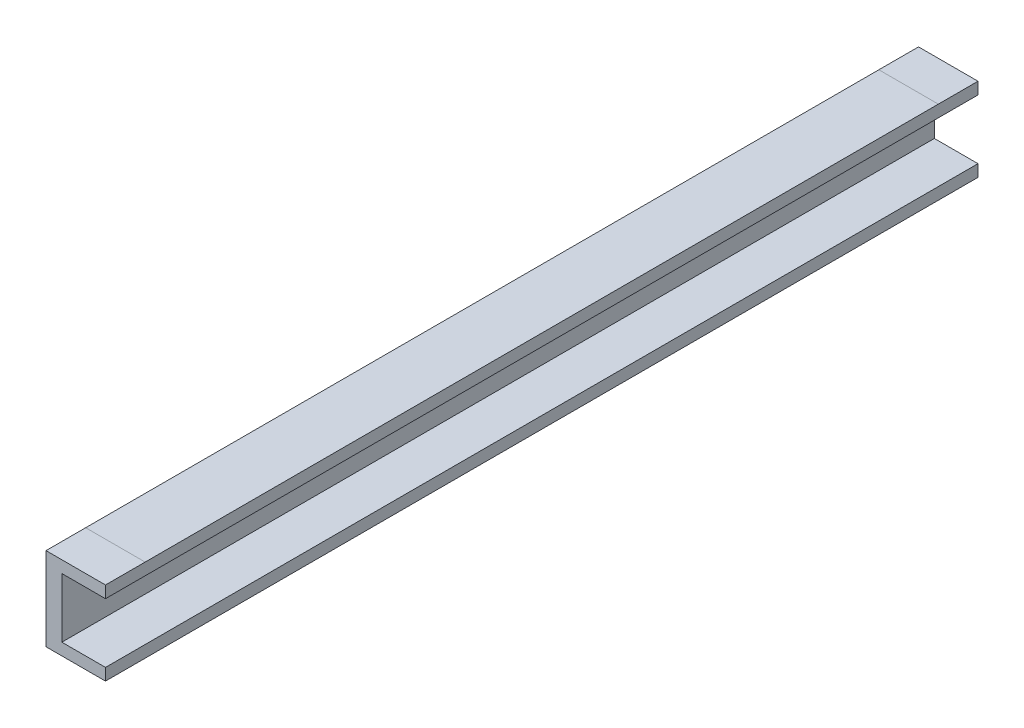
ISO-10303-21;
HEADER;
FILE_DESCRIPTION(('STEP AP214'),'2;1');
FILE_NAME('part.step','',(''),(''),'','','');
FILE_SCHEMA(('AUTOMOTIVE_DESIGN { 1 0 10303 214 1 1 1 1 }'));
ENDSEC;
DATA;
#1=APPLICATION_CONTEXT('core data for automotive mechanical design processes');
#2=APPLICATION_PROTOCOL_DEFINITION('international standard','automotive_design',2000,#1);
#3=PRODUCT_CONTEXT('',#1,'mechanical');
#4=PRODUCT('Part','Part','',(#3));
#5=PRODUCT_RELATED_PRODUCT_CATEGORY('part','',(#4));
#6=PRODUCT_DEFINITION_FORMATION('','',#4);
#7=PRODUCT_DEFINITION_CONTEXT('part definition',#1,'design');
#8=PRODUCT_DEFINITION('design','',#6,#7);
#9=PRODUCT_DEFINITION_SHAPE('','',#8);
#10=(LENGTH_UNIT() NAMED_UNIT(*) SI_UNIT(.MILLI.,.METRE.));
#11=(NAMED_UNIT(*) PLANE_ANGLE_UNIT() SI_UNIT($,.RADIAN.));
#12=(NAMED_UNIT(*) SI_UNIT($,.STERADIAN.) SOLID_ANGLE_UNIT());
#13=UNCERTAINTY_MEASURE_WITH_UNIT(LENGTH_MEASURE(1.E-05),#10,'distance_accuracy_value','');
#14=(GEOMETRIC_REPRESENTATION_CONTEXT(3) GLOBAL_UNCERTAINTY_ASSIGNED_CONTEXT((#13)) GLOBAL_UNIT_ASSIGNED_CONTEXT((#10,
#11,#12)) REPRESENTATION_CONTEXT('',''));
#15=CARTESIAN_POINT('',(0.,0.,0.));
#16=DIRECTION('',(0.,0.,1.));
#17=DIRECTION('',(1.,0.,0.));
#18=AXIS2_PLACEMENT_3D('',#15,#16,#17);
#19=CARTESIAN_POINT('',(150.,0.,2200.));
#20=DIRECTION('',(0.,1.,0.));
#21=DIRECTION('',(-1.,0.,0.));
#22=AXIS2_PLACEMENT_3D('',#19,#20,#21);
#23=PLANE('',#22);
#24=DIRECTION('',(-1.,0.,0.));
#25=VECTOR('',#24,1.);
#26=CARTESIAN_POINT('',(150.,0.,2100.));
#27=LINE('',#26,#25);
#28=CARTESIAN_POINT('',(150.,0.,2100.));
#29=VERTEX_POINT('',#28);
#30=CARTESIAN_POINT('',(0.,0.,2100.));
#31=VERTEX_POINT('',#30);
#32=EDGE_CURVE('E12',#29,#31,#27,.T.);
#33=ORIENTED_EDGE('',*,*,#32,.F.);
#34=DIRECTION('',(0.,0.,-1.));
#35=VECTOR('',#34,1.);
#36=CARTESIAN_POINT('',(150.,0.,2200.));
#37=LINE('',#36,#35);
#38=CARTESIAN_POINT('',(150.,0.,2200.));
#39=VERTEX_POINT('',#38);
#40=EDGE_CURVE('E142',#39,#29,#37,.T.);
#41=ORIENTED_EDGE('',*,*,#40,.F.);
#42=DIRECTION('',(1.,0.,0.));
#43=VECTOR('',#42,1.);
#44=CARTESIAN_POINT('',(150.,0.,2200.));
#45=LINE('',#44,#43);
#46=CARTESIAN_POINT('',(0.,0.,2200.));
#47=VERTEX_POINT('',#46);
#48=EDGE_CURVE('E148',#47,#39,#45,.T.);
#49=ORIENTED_EDGE('',*,*,#48,.F.);
#50=DIRECTION('',(0.,0.,-1.));
#51=VECTOR('',#50,1.);
#52=CARTESIAN_POINT('',(0.,0.,2200.));
#53=LINE('',#52,#51);
#54=EDGE_CURVE('E191',#47,#31,#53,.T.);
#55=ORIENTED_EDGE('',*,*,#54,.T.);
#56=EDGE_LOOP('',(#33,#41,#49,#55));
#57=FACE_BOUND('',#56,.T.);
#58=ADVANCED_FACE('F52',(#57),#23,.F.);
#59=CARTESIAN_POINT('',(0.,210.,2200.));
#60=DIRECTION('',(0.,-1.,0.));
#61=DIRECTION('',(0.,0.,-1.));
#62=AXIS2_PLACEMENT_3D('',#59,#60,#61);
#63=PLANE('',#62);
#64=DIRECTION('',(1.,0.,0.));
#65=VECTOR('',#64,1.);
#66=CARTESIAN_POINT('',(0.,210.,2100.));
#67=LINE('',#66,#65);
#68=CARTESIAN_POINT('',(0.,210.,2100.));
#69=VERTEX_POINT('',#68);
#70=CARTESIAN_POINT('',(150.,210.,2100.));
#71=VERTEX_POINT('',#70);
#72=EDGE_CURVE('E56',#69,#71,#67,.T.);
#73=ORIENTED_EDGE('',*,*,#72,.F.);
#74=DIRECTION('',(0.,0.,-1.));
#75=VECTOR('',#74,1.);
#76=CARTESIAN_POINT('',(0.,210.,2200.));
#77=LINE('',#76,#75);
#78=CARTESIAN_POINT('',(0.,210.,2200.));
#79=VERTEX_POINT('',#78);
#80=EDGE_CURVE('E186',#79,#69,#77,.T.);
#81=ORIENTED_EDGE('',*,*,#80,.F.);
#82=DIRECTION('',(-1.,0.,0.));
#83=VECTOR('',#82,1.);
#84=CARTESIAN_POINT('',(0.,210.,2200.));
#85=LINE('',#84,#83);
#86=CARTESIAN_POINT('',(150.,210.,2200.));
#87=VERTEX_POINT('',#86);
#88=EDGE_CURVE('E216',#87,#79,#85,.T.);
#89=ORIENTED_EDGE('',*,*,#88,.F.);
#90=DIRECTION('',(0.,0.,-1.));
#91=VECTOR('',#90,1.);
#92=CARTESIAN_POINT('',(150.,210.,2200.));
#93=LINE('',#92,#91);
#94=EDGE_CURVE('E181',#87,#71,#93,.T.);
#95=ORIENTED_EDGE('',*,*,#94,.T.);
#96=EDGE_LOOP('',(#73,#81,#89,#95));
#97=FACE_BOUND('',#96,.T.);
#98=ADVANCED_FACE('F245',(#97),#63,.F.);
#99=CARTESIAN_POINT('',(150.,0.,100.));
#100=VERTEX_POINT('',#99);
#101=EDGE_CURVE('E158',#29,#100,#37,.T.);
#102=ORIENTED_EDGE('',*,*,#101,.F.);
#103=ORIENTED_EDGE('',*,*,#32,.T.);
#104=CARTESIAN_POINT('',(0.,0.,100.));
#105=VERTEX_POINT('',#104);
#106=EDGE_CURVE('E192',#31,#105,#53,.T.);
#107=ORIENTED_EDGE('',*,*,#106,.T.);
#108=DIRECTION('',(-1.,0.,0.));
#109=VECTOR('',#108,1.);
#110=CARTESIAN_POINT('',(150.,0.,100.));
#111=LINE('',#110,#109);
#112=EDGE_CURVE('E163',#100,#105,#111,.T.);
#113=ORIENTED_EDGE('',*,*,#112,.F.);
#114=EDGE_LOOP('',(#102,#103,#107,#113));
#115=FACE_BOUND('',#114,.T.);
#116=ADVANCED_FACE('F281',(#115),#23,.F.);
#117=CARTESIAN_POINT('',(0.,210.,100.));
#118=VERTEX_POINT('',#117);
#119=EDGE_CURVE('E189',#69,#118,#77,.T.);
#120=ORIENTED_EDGE('',*,*,#119,.F.);
#121=ORIENTED_EDGE('',*,*,#72,.T.);
#122=CARTESIAN_POINT('',(150.,210.,100.));
#123=VERTEX_POINT('',#122);
#124=EDGE_CURVE('E184',#71,#123,#93,.T.);
#125=ORIENTED_EDGE('',*,*,#124,.T.);
#126=DIRECTION('',(1.,0.,0.));
#127=VECTOR('',#126,1.);
#128=CARTESIAN_POINT('',(0.,210.,100.));
#129=LINE('',#128,#127);
#130=EDGE_CURVE('E157',#118,#123,#129,.T.);
#131=ORIENTED_EDGE('',*,*,#130,.F.);
#132=EDGE_LOOP('',(#120,#121,#125,#131));
#133=FACE_BOUND('',#132,.T.);
#134=ADVANCED_FACE('F264',(#133),#63,.F.);
#135=CARTESIAN_POINT('',(150.,0.,0.));
#136=VERTEX_POINT('',#135);
#137=EDGE_CURVE('E160',#100,#136,#37,.T.);
#138=ORIENTED_EDGE('',*,*,#137,.F.);
#139=ORIENTED_EDGE('',*,*,#112,.T.);
#140=CARTESIAN_POINT('',(0.,0.,0.));
#141=VERTEX_POINT('',#140);
#142=EDGE_CURVE('E193',#105,#141,#53,.T.);
#143=ORIENTED_EDGE('',*,*,#142,.T.);
#144=DIRECTION('',(1.,0.,0.));
#145=VECTOR('',#144,1.);
#146=CARTESIAN_POINT('',(150.,0.,0.));
#147=LINE('',#146,#145);
#148=EDGE_CURVE('E212',#141,#136,#147,.T.);
#149=ORIENTED_EDGE('',*,*,#148,.T.);
#150=EDGE_LOOP('',(#138,#139,#143,#149));
#151=FACE_BOUND('',#150,.T.);
#152=ADVANCED_FACE('F54',(#151),#23,.F.);
#153=CARTESIAN_POINT('',(150.,30.,2200.));
#154=DIRECTION('',(-1.,0.,0.));
#155=DIRECTION('',(0.,-1.,0.));
#156=AXIS2_PLACEMENT_3D('',#153,#154,#155);
#157=PLANE('',#156);
#158=DIRECTION('',(0.,1.,0.));
#159=VECTOR('',#158,1.);
#160=CARTESIAN_POINT('',(150.,30.,0.));
#161=LINE('',#160,#159);
#162=CARTESIAN_POINT('',(150.,30.,0.));
#163=VERTEX_POINT('',#162);
#164=EDGE_CURVE('E210',#136,#163,#161,.T.);
#165=ORIENTED_EDGE('',*,*,#164,.T.);
#166=DIRECTION('',(0.,0.,-1.));
#167=VECTOR('',#166,1.);
#168=CARTESIAN_POINT('',(150.,30.,2200.));
#169=LINE('',#168,#167);
#170=CARTESIAN_POINT('',(150.,30.,2200.));
#171=VERTEX_POINT('',#170);
#172=EDGE_CURVE('E144',#171,#163,#169,.T.);
#173=ORIENTED_EDGE('',*,*,#172,.F.);
#174=DIRECTION('',(0.,1.,0.));
#175=VECTOR('',#174,1.);
#176=CARTESIAN_POINT('',(150.,30.,2200.));
#177=LINE('',#176,#175);
#178=EDGE_CURVE('E139',#39,#171,#177,.T.);
#179=ORIENTED_EDGE('',*,*,#178,.F.);
#180=ORIENTED_EDGE('',*,*,#40,.T.);
#181=ORIENTED_EDGE('',*,*,#101,.T.);
#182=ORIENTED_EDGE('',*,*,#137,.T.);
#183=EDGE_LOOP('',(#165,#173,#179,#180,#181,#182));
#184=FACE_BOUND('',#183,.T.);
#185=ADVANCED_FACE('F141',(#184),#157,.F.);
#186=CARTESIAN_POINT('',(40.,30.,2200.));
#187=DIRECTION('',(0.,-1.,0.));
#188=DIRECTION('',(1.,0.,0.));
#189=AXIS2_PLACEMENT_3D('',#186,#187,#188);
#190=PLANE('',#189);
#191=DIRECTION('',(-1.,0.,0.));
#192=VECTOR('',#191,1.);
#193=CARTESIAN_POINT('',(40.,30.,0.));
#194=LINE('',#193,#192);
#195=CARTESIAN_POINT('',(40.,30.,0.));
#196=VERTEX_POINT('',#195);
#197=EDGE_CURVE('E208',#163,#196,#194,.T.);
#198=ORIENTED_EDGE('',*,*,#197,.T.);
#199=DIRECTION('',(0.,0.,-1.));
#200=VECTOR('',#199,1.);
#201=CARTESIAN_POINT('',(40.,30.,2200.));
#202=LINE('',#201,#200);
#203=CARTESIAN_POINT('',(40.,30.,2200.));
#204=VERTEX_POINT('',#203);
#205=EDGE_CURVE('E169',#204,#196,#202,.T.);
#206=ORIENTED_EDGE('',*,*,#205,.F.);
#207=DIRECTION('',(-1.,0.,0.));
#208=VECTOR('',#207,1.);
#209=CARTESIAN_POINT('',(40.,30.,2200.));
#210=LINE('',#209,#208);
#211=EDGE_CURVE('E147',#171,#204,#210,.T.);
#212=ORIENTED_EDGE('',*,*,#211,.F.);
#213=ORIENTED_EDGE('',*,*,#172,.T.);
#214=EDGE_LOOP('',(#198,#206,#212,#213));
#215=FACE_BOUND('',#214,.T.);
#216=ADVANCED_FACE('F227',(#215),#190,.F.);
#217=CARTESIAN_POINT('',(40.,180.,2200.));
#218=DIRECTION('',(-1.,0.,0.));
#219=DIRECTION('',(0.,-1.,0.));
#220=AXIS2_PLACEMENT_3D('',#217,#218,#219);
#221=PLANE('',#220);
#222=DIRECTION('',(0.,1.,0.));
#223=VECTOR('',#222,1.);
#224=CARTESIAN_POINT('',(40.,180.,0.));
#225=LINE('',#224,#223);
#226=CARTESIAN_POINT('',(40.,180.,0.));
#227=VERTEX_POINT('',#226);
#228=EDGE_CURVE('E206',#196,#227,#225,.T.);
#229=ORIENTED_EDGE('',*,*,#228,.T.);
#230=DIRECTION('',(0.,0.,-1.));
#231=VECTOR('',#230,1.);
#232=CARTESIAN_POINT('',(40.,180.,2200.));
#233=LINE('',#232,#231);
#234=CARTESIAN_POINT('',(40.,180.,2200.));
#235=VERTEX_POINT('',#234);
#236=EDGE_CURVE('E173',#235,#227,#233,.T.);
#237=ORIENTED_EDGE('',*,*,#236,.F.);
#238=DIRECTION('',(0.,1.,0.));
#239=VECTOR('',#238,1.);
#240=CARTESIAN_POINT('',(40.,180.,2200.));
#241=LINE('',#240,#239);
#242=EDGE_CURVE('E222',#204,#235,#241,.T.);
#243=ORIENTED_EDGE('',*,*,#242,.F.);
#244=ORIENTED_EDGE('',*,*,#205,.T.);
#245=EDGE_LOOP('',(#229,#237,#243,#244));
#246=FACE_BOUND('',#245,.T.);
#247=ADVANCED_FACE('F230',(#246),#221,.F.);
#248=CARTESIAN_POINT('',(150.,180.,2200.));
#249=DIRECTION('',(0.,1.,0.));
#250=DIRECTION('',(0.,0.,1.));
#251=AXIS2_PLACEMENT_3D('',#248,#249,#250);
#252=PLANE('',#251);
#253=DIRECTION('',(1.,0.,0.));
#254=VECTOR('',#253,1.);
#255=CARTESIAN_POINT('',(150.,180.,0.));
#256=LINE('',#255,#254);
#257=CARTESIAN_POINT('',(150.,180.,0.));
#258=VERTEX_POINT('',#257);
#259=EDGE_CURVE('E204',#227,#258,#256,.T.);
#260=ORIENTED_EDGE('',*,*,#259,.T.);
#261=DIRECTION('',(0.,0.,-1.));
#262=VECTOR('',#261,1.);
#263=CARTESIAN_POINT('',(150.,180.,2200.));
#264=LINE('',#263,#262);
#265=CARTESIAN_POINT('',(150.,180.,2200.));
#266=VERTEX_POINT('',#265);
#267=EDGE_CURVE('E178',#266,#258,#264,.T.);
#268=ORIENTED_EDGE('',*,*,#267,.F.);
#269=DIRECTION('',(1.,0.,0.));
#270=VECTOR('',#269,1.);
#271=CARTESIAN_POINT('',(150.,180.,2200.));
#272=LINE('',#271,#270);
#273=EDGE_CURVE('E220',#235,#266,#272,.T.);
#274=ORIENTED_EDGE('',*,*,#273,.F.);
#275=ORIENTED_EDGE('',*,*,#236,.T.);
#276=EDGE_LOOP('',(#260,#268,#274,#275));
#277=FACE_BOUND('',#276,.T.);
#278=ADVANCED_FACE('F235',(#277),#252,.F.);
#279=CARTESIAN_POINT('',(150.,210.,2200.));
#280=DIRECTION('',(-1.,0.,0.));
#281=DIRECTION('',(0.,0.,1.));
#282=AXIS2_PLACEMENT_3D('',#279,#280,#281);
#283=PLANE('',#282);
#284=DIRECTION('',(0.,1.,0.));
#285=VECTOR('',#284,1.);
#286=CARTESIAN_POINT('',(150.,210.,0.));
#287=LINE('',#286,#285);
#288=CARTESIAN_POINT('',(150.,210.,0.));
#289=VERTEX_POINT('',#288);
#290=EDGE_CURVE('E201',#258,#289,#287,.T.);
#291=ORIENTED_EDGE('',*,*,#290,.T.);
#292=EDGE_CURVE('E185',#123,#289,#93,.T.);
#293=ORIENTED_EDGE('',*,*,#292,.F.);
#294=ORIENTED_EDGE('',*,*,#124,.F.);
#295=ORIENTED_EDGE('',*,*,#94,.F.);
#296=DIRECTION('',(0.,1.,0.));
#297=VECTOR('',#296,1.);
#298=CARTESIAN_POINT('',(150.,210.,2200.));
#299=LINE('',#298,#297);
#300=EDGE_CURVE('E218',#266,#87,#299,.T.);
#301=ORIENTED_EDGE('',*,*,#300,.F.);
#302=ORIENTED_EDGE('',*,*,#267,.T.);
#303=EDGE_LOOP('',(#291,#293,#294,#295,#301,#302));
#304=FACE_BOUND('',#303,.T.);
#305=ADVANCED_FACE('F242',(#304),#283,.F.);
#306=CARTESIAN_POINT('',(0.,210.,0.));
#307=VERTEX_POINT('',#306);
#308=EDGE_CURVE('E190',#118,#307,#77,.T.);
#309=ORIENTED_EDGE('',*,*,#308,.F.);
#310=ORIENTED_EDGE('',*,*,#130,.T.);
#311=ORIENTED_EDGE('',*,*,#292,.T.);
#312=DIRECTION('',(-1.,0.,0.));
#313=VECTOR('',#312,1.);
#314=CARTESIAN_POINT('',(0.,210.,0.));
#315=LINE('',#314,#313);
#316=EDGE_CURVE('E198',#289,#307,#315,.T.);
#317=ORIENTED_EDGE('',*,*,#316,.T.);
#318=EDGE_LOOP('',(#309,#310,#311,#317));
#319=FACE_BOUND('',#318,.T.);
#320=ADVANCED_FACE('F261',(#319),#63,.F.);
#321=CARTESIAN_POINT('',(0.,0.,2200.));
#322=DIRECTION('',(1.,0.,0.));
#323=DIRECTION('',(0.,0.,-1.));
#324=AXIS2_PLACEMENT_3D('',#321,#322,#323);
#325=PLANE('',#324);
#326=DIRECTION('',(0.,-1.,0.));
#327=VECTOR('',#326,1.);
#328=CARTESIAN_POINT('',(0.,0.,0.));
#329=LINE('',#328,#327);
#330=EDGE_CURVE('E155',#307,#141,#329,.T.);
#331=ORIENTED_EDGE('',*,*,#330,.T.);
#332=ORIENTED_EDGE('',*,*,#142,.F.);
#333=ORIENTED_EDGE('',*,*,#106,.F.);
#334=ORIENTED_EDGE('',*,*,#54,.F.);
#335=DIRECTION('',(0.,-1.,0.));
#336=VECTOR('',#335,1.);
#337=CARTESIAN_POINT('',(0.,0.,2200.));
#338=LINE('',#337,#336);
#339=EDGE_CURVE('E153',#79,#47,#338,.T.);
#340=ORIENTED_EDGE('',*,*,#339,.F.);
#341=ORIENTED_EDGE('',*,*,#80,.T.);
#342=ORIENTED_EDGE('',*,*,#119,.T.);
#343=ORIENTED_EDGE('',*,*,#308,.T.);
#344=EDGE_LOOP('',(#331,#332,#333,#334,#340,#341,#342,#343));
#345=FACE_BOUND('',#344,.T.);
#346=ADVANCED_FACE('F248',(#345),#325,.F.);
#347=CARTESIAN_POINT('',(0.,0.,2200.));
#348=DIRECTION('',(0.,0.,-1.));
#349=DIRECTION('',(-1.,0.,0.));
#350=AXIS2_PLACEMENT_3D('',#347,#348,#349);
#351=PLANE('',#350);
#352=ORIENTED_EDGE('',*,*,#48,.T.);
#353=ORIENTED_EDGE('',*,*,#178,.T.);
#354=ORIENTED_EDGE('',*,*,#211,.T.);
#355=ORIENTED_EDGE('',*,*,#242,.T.);
#356=ORIENTED_EDGE('',*,*,#273,.T.);
#357=ORIENTED_EDGE('',*,*,#300,.T.);
#358=ORIENTED_EDGE('',*,*,#88,.T.);
#359=ORIENTED_EDGE('',*,*,#339,.T.);
#360=EDGE_LOOP('',(#352,#353,#354,#355,#356,#357,#358,#359));
#361=FACE_BOUND('',#360,.T.);
#362=ADVANCED_FACE('F151',(#361),#351,.F.);
#363=CARTESIAN_POINT('',(0.,0.,0.));
#364=DIRECTION('',(0.,0.,-1.));
#365=DIRECTION('',(-1.,0.,0.));
#366=AXIS2_PLACEMENT_3D('',#363,#364,#365);
#367=PLANE('',#366);
#368=ORIENTED_EDGE('',*,*,#148,.F.);
#369=ORIENTED_EDGE('',*,*,#330,.F.);
#370=ORIENTED_EDGE('',*,*,#316,.F.);
#371=ORIENTED_EDGE('',*,*,#290,.F.);
#372=ORIENTED_EDGE('',*,*,#259,.F.);
#373=ORIENTED_EDGE('',*,*,#228,.F.);
#374=ORIENTED_EDGE('',*,*,#197,.F.);
#375=ORIENTED_EDGE('',*,*,#164,.F.);
#376=EDGE_LOOP('',(#368,#369,#370,#371,#372,#373,#374,#375));
#377=FACE_BOUND('',#376,.T.);
#378=ADVANCED_FACE('F258',(#377),#367,.T.);
#379=CLOSED_SHELL('',(#58,#98,#116,#134,#152,#185,#216,#247,#278,#305,#320,#346,#362,#378));
#380=MANIFOLD_SOLID_BREP('B2',#379);
#381=ADVANCED_BREP_SHAPE_REPRESENTATION('',(#18,#380),#14);
#382=SHAPE_DEFINITION_REPRESENTATION(#9,#381);
ENDSEC;
END-ISO-10303-21;
